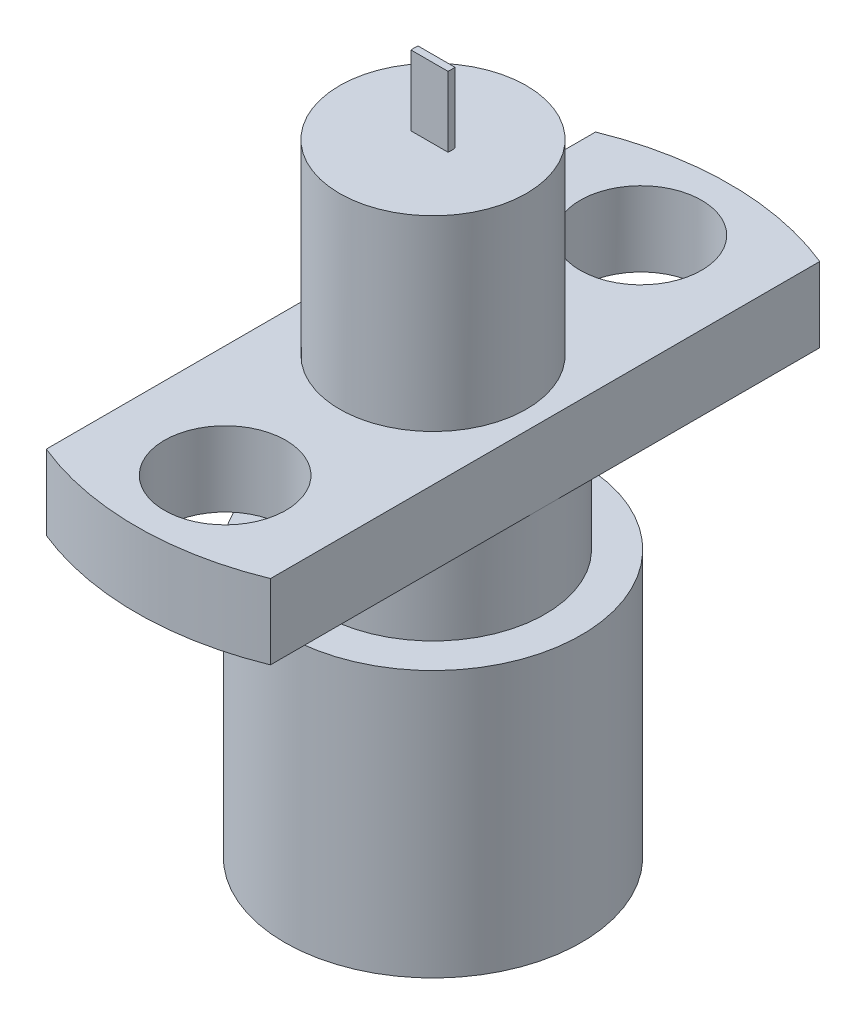
ISO-10303-21;
HEADER;
FILE_DESCRIPTION(('STEP AP214'),'2;1');
FILE_NAME('part.step','',(''),(''),'','','');
FILE_SCHEMA(('AUTOMOTIVE_DESIGN { 1 0 10303 214 1 1 1 1 }'));
ENDSEC;
DATA;
#1=APPLICATION_CONTEXT('core data for automotive mechanical design processes');
#2=APPLICATION_PROTOCOL_DEFINITION('international standard','automotive_design',2000,#1);
#3=PRODUCT_CONTEXT('',#1,'mechanical');
#4=PRODUCT('Part','Part','',(#3));
#5=PRODUCT_RELATED_PRODUCT_CATEGORY('part','',(#4));
#6=PRODUCT_DEFINITION_FORMATION('','',#4);
#7=PRODUCT_DEFINITION_CONTEXT('part definition',#1,'design');
#8=PRODUCT_DEFINITION('design','',#6,#7);
#9=PRODUCT_DEFINITION_SHAPE('','',#8);
#10=(LENGTH_UNIT() NAMED_UNIT(*) SI_UNIT(.MILLI.,.METRE.));
#11=(NAMED_UNIT(*) PLANE_ANGLE_UNIT() SI_UNIT($,.RADIAN.));
#12=(NAMED_UNIT(*) SI_UNIT($,.STERADIAN.) SOLID_ANGLE_UNIT());
#13=UNCERTAINTY_MEASURE_WITH_UNIT(LENGTH_MEASURE(1.E-05),#10,'distance_accuracy_value','');
#14=(GEOMETRIC_REPRESENTATION_CONTEXT(3) GLOBAL_UNCERTAINTY_ASSIGNED_CONTEXT((#13)) GLOBAL_UNIT_ASSIGNED_CONTEXT((#10,
#11,#12)) REPRESENTATION_CONTEXT('',''));
#15=CARTESIAN_POINT('',(0.,0.,0.));
#16=DIRECTION('',(0.,0.,1.));
#17=DIRECTION('',(1.,0.,0.));
#18=AXIS2_PLACEMENT_3D('',#15,#16,#17);
#19=CARTESIAN_POINT('',(0.,0.,0.));
#20=DIRECTION('',(0.,-1.,0.));
#21=DIRECTION('',(0.,0.,-1.));
#22=AXIS2_PLACEMENT_3D('',#19,#20,#21);
#23=PLANE('',#22);
#24=CARTESIAN_POINT('',(0.,0.,0.));
#25=DIRECTION('',(0.,-1.,0.));
#26=DIRECTION('',(0.,0.,-1.));
#27=AXIS2_PLACEMENT_3D('',#24,#25,#26);
#28=CIRCLE('',#27,2.4);
#29=CARTESIAN_POINT('',(2.4,0.,0.));
#30=VERTEX_POINT('',#29);
#31=CARTESIAN_POINT('',(-2.4,0.,0.));
#32=VERTEX_POINT('',#31);
#33=EDGE_CURVE('E48',#30,#32,#28,.T.);
#34=ORIENTED_EDGE('',*,*,#33,.F.);
#35=DIRECTION('',(0.,0.,-1.));
#36=VECTOR('',#35,1.);
#37=CARTESIAN_POINT('',(2.4,0.,-5.87898800815242));
#38=LINE('',#37,#36);
#39=CARTESIAN_POINT('',(2.4,0.,5.87898800815242));
#40=VERTEX_POINT('',#39);
#41=EDGE_CURVE('E111',#40,#30,#38,.T.);
#42=ORIENTED_EDGE('',*,*,#41,.F.);
#43=CARTESIAN_POINT('',(0.,0.,0.));
#44=DIRECTION('',(0.,1.,0.));
#45=DIRECTION('',(0.,0.,1.));
#46=AXIS2_PLACEMENT_3D('',#43,#44,#45);
#47=CIRCLE('',#46,6.35);
#48=CARTESIAN_POINT('',(-2.4,0.,5.87898800815242));
#49=VERTEX_POINT('',#48);
#50=EDGE_CURVE('E129',#49,#40,#47,.T.);
#51=ORIENTED_EDGE('',*,*,#50,.F.);
#52=DIRECTION('',(0.,0.,1.));
#53=VECTOR('',#52,1.);
#54=CARTESIAN_POINT('',(-2.4,0.,-5.87898800815242));
#55=LINE('',#54,#53);
#56=EDGE_CURVE('E132',#32,#49,#55,.T.);
#57=ORIENTED_EDGE('',*,*,#56,.F.);
#58=EDGE_LOOP('',(#34,#42,#51,#57));
#59=FACE_BOUND('',#58,.T.);
#60=CARTESIAN_POINT('',(0.,0.,4.45));
#61=DIRECTION('',(0.,-1.,0.));
#62=DIRECTION('',(0.,0.,-1.));
#63=AXIS2_PLACEMENT_3D('',#60,#61,#62);
#64=CIRCLE('',#63,1.3);
#65=CARTESIAN_POINT('',(0.,0.,3.15));
#66=VERTEX_POINT('',#65);
#67=EDGE_CURVE('E242',#66,#66,#64,.F.);
#68=ORIENTED_EDGE('',*,*,#67,.T.);
#69=EDGE_LOOP('',(#68));
#70=FACE_BOUND('',#69,.T.);
#71=ADVANCED_FACE('F38',(#59,#70),#23,.T.);
#72=CARTESIAN_POINT('',(0.,5.6,0.));
#73=DIRECTION('',(0.,1.,0.));
#74=DIRECTION('',(0.,0.,1.));
#75=AXIS2_PLACEMENT_3D('',#72,#73,#74);
#76=PLANE('',#75);
#77=CARTESIAN_POINT('',(0.,5.6,0.));
#78=DIRECTION('',(0.,1.,0.));
#79=DIRECTION('',(0.,0.,1.));
#80=AXIS2_PLACEMENT_3D('',#77,#78,#79);
#81=CIRCLE('',#80,2.);
#82=CARTESIAN_POINT('',(0.,5.6,2.));
#83=VERTEX_POINT('',#82);
#84=EDGE_CURVE('E239',#83,#83,#81,.T.);
#85=ORIENTED_EDGE('',*,*,#84,.T.);
#86=EDGE_LOOP('',(#85));
#87=FACE_BOUND('',#86,.T.);
#88=DIRECTION('',(-1.,0.,0.));
#89=VECTOR('',#88,1.);
#90=CARTESIAN_POINT('',(0.392905841137543,5.6,-0.075));
#91=LINE('',#90,#89);
#92=CARTESIAN_POINT('',(0.392905841137543,5.6,-0.075));
#93=VERTEX_POINT('',#92);
#94=CARTESIAN_POINT('',(-0.392905841137543,5.6,-0.075));
#95=VERTEX_POINT('',#94);
#96=EDGE_CURVE('E224',#93,#95,#91,.T.);
#97=ORIENTED_EDGE('',*,*,#96,.F.);
#98=CARTESIAN_POINT('',(0.,5.6,0.));
#99=DIRECTION('',(0.,1.,0.));
#100=DIRECTION('',(0.,0.,-1.));
#101=AXIS2_PLACEMENT_3D('',#98,#99,#100);
#102=CIRCLE('',#101,0.4);
#103=CARTESIAN_POINT('',(0.392905841137543,5.6,0.075));
#104=VERTEX_POINT('',#103);
#105=EDGE_CURVE('E219',#104,#93,#102,.T.);
#106=ORIENTED_EDGE('',*,*,#105,.F.);
#107=DIRECTION('',(1.,0.,0.));
#108=VECTOR('',#107,1.);
#109=CARTESIAN_POINT('',(0.392905841137543,5.6,0.075));
#110=LINE('',#109,#108);
#111=CARTESIAN_POINT('',(-0.392905841137543,5.6,0.075));
#112=VERTEX_POINT('',#111);
#113=EDGE_CURVE('E207',#112,#104,#110,.T.);
#114=ORIENTED_EDGE('',*,*,#113,.F.);
#115=CARTESIAN_POINT('',(0.,5.6,0.));
#116=DIRECTION('',(0.,1.,0.));
#117=DIRECTION('',(0.,0.,1.));
#118=AXIS2_PLACEMENT_3D('',#115,#116,#117);
#119=CIRCLE('',#118,0.4);
#120=EDGE_CURVE('E215',#95,#112,#119,.T.);
#121=ORIENTED_EDGE('',*,*,#120,.F.);
#122=EDGE_LOOP('',(#97,#106,#114,#121));
#123=FACE_BOUND('',#122,.T.);
#124=ADVANCED_FACE('F156',(#87,#123),#76,.T.);
#125=CARTESIAN_POINT('',(0.,1.6,0.));
#126=DIRECTION('',(0.,-1.,0.));
#127=DIRECTION('',(0.,0.,-1.));
#128=AXIS2_PLACEMENT_3D('',#125,#126,#127);
#129=CYLINDRICAL_SURFACE('',#128,6.35);
#130=CARTESIAN_POINT('',(0.,0.,0.));
#131=DIRECTION('',(0.,1.,0.));
#132=DIRECTION('',(0.,0.,-1.));
#133=AXIS2_PLACEMENT_3D('',#130,#131,#132);
#134=CIRCLE('',#133,6.35);
#135=CARTESIAN_POINT('',(2.4,0.,-5.87898800815242));
#136=VERTEX_POINT('',#135);
#137=CARTESIAN_POINT('',(-2.4,0.,-5.87898800815242));
#138=VERTEX_POINT('',#137);
#139=EDGE_CURVE('E128',#136,#138,#134,.T.);
#140=ORIENTED_EDGE('',*,*,#139,.T.);
#141=DIRECTION('',(0.,-1.,0.));
#142=VECTOR('',#141,1.);
#143=CARTESIAN_POINT('',(-2.4,1.6,-5.87898800815242));
#144=LINE('',#143,#142);
#145=CARTESIAN_POINT('',(-2.4,1.6,-5.87898800815242));
#146=VERTEX_POINT('',#145);
#147=EDGE_CURVE('E271',#146,#138,#144,.T.);
#148=ORIENTED_EDGE('',*,*,#147,.F.);
#149=CARTESIAN_POINT('',(0.,1.6,0.));
#150=DIRECTION('',(0.,1.,0.));
#151=DIRECTION('',(0.,0.,-1.));
#152=AXIS2_PLACEMENT_3D('',#149,#150,#151);
#153=CIRCLE('',#152,6.35);
#154=CARTESIAN_POINT('',(2.4,1.6,-5.87898800815242));
#155=VERTEX_POINT('',#154);
#156=EDGE_CURVE('E122',#155,#146,#153,.T.);
#157=ORIENTED_EDGE('',*,*,#156,.F.);
#158=DIRECTION('',(0.,-1.,0.));
#159=VECTOR('',#158,1.);
#160=CARTESIAN_POINT('',(2.4,1.6,-5.87898800815242));
#161=LINE('',#160,#159);
#162=EDGE_CURVE('E262',#155,#136,#161,.T.);
#163=ORIENTED_EDGE('',*,*,#162,.T.);
#164=EDGE_LOOP('',(#140,#148,#157,#163));
#165=FACE_BOUND('',#164,.T.);
#166=ADVANCED_FACE('F40',(#165),#129,.T.);
#167=CARTESIAN_POINT('',(-2.4,1.6,-5.87898800815242));
#168=DIRECTION('',(1.,0.,0.));
#169=DIRECTION('',(0.,0.,-1.));
#170=AXIS2_PLACEMENT_3D('',#167,#168,#169);
#171=PLANE('',#170);
#172=EDGE_CURVE('E264',#138,#32,#55,.T.);
#173=ORIENTED_EDGE('',*,*,#172,.T.);
#174=ORIENTED_EDGE('',*,*,#56,.T.);
#175=DIRECTION('',(0.,-1.,0.));
#176=VECTOR('',#175,1.);
#177=CARTESIAN_POINT('',(-2.4,1.6,5.87898800815242));
#178=LINE('',#177,#176);
#179=CARTESIAN_POINT('',(-2.4,1.6,5.87898800815242));
#180=VERTEX_POINT('',#179);
#181=EDGE_CURVE('E269',#180,#49,#178,.T.);
#182=ORIENTED_EDGE('',*,*,#181,.F.);
#183=DIRECTION('',(0.,0.,1.));
#184=VECTOR('',#183,1.);
#185=CARTESIAN_POINT('',(-2.4,1.6,-5.87898800815242));
#186=LINE('',#185,#184);
#187=EDGE_CURVE('E256',#146,#180,#186,.T.);
#188=ORIENTED_EDGE('',*,*,#187,.F.);
#189=ORIENTED_EDGE('',*,*,#147,.T.);
#190=EDGE_LOOP('',(#173,#174,#182,#188,#189));
#191=FACE_BOUND('',#190,.T.);
#192=ADVANCED_FACE('F277',(#191),#171,.F.);
#193=CARTESIAN_POINT('',(0.,1.6,0.));
#194=DIRECTION('',(0.,-1.,0.));
#195=DIRECTION('',(0.,0.,-1.));
#196=AXIS2_PLACEMENT_3D('',#193,#194,#195);
#197=CYLINDRICAL_SURFACE('',#196,6.35);
#198=ORIENTED_EDGE('',*,*,#50,.T.);
#199=DIRECTION('',(0.,-1.,0.));
#200=VECTOR('',#199,1.);
#201=CARTESIAN_POINT('',(2.4,1.6,5.87898800815242));
#202=LINE('',#201,#200);
#203=CARTESIAN_POINT('',(2.4,1.6,5.87898800815242));
#204=VERTEX_POINT('',#203);
#205=EDGE_CURVE('E118',#204,#40,#202,.T.);
#206=ORIENTED_EDGE('',*,*,#205,.F.);
#207=CARTESIAN_POINT('',(0.,1.6,0.));
#208=DIRECTION('',(0.,1.,0.));
#209=DIRECTION('',(0.,0.,1.));
#210=AXIS2_PLACEMENT_3D('',#207,#208,#209);
#211=CIRCLE('',#210,6.35);
#212=EDGE_CURVE('E258',#180,#204,#211,.T.);
#213=ORIENTED_EDGE('',*,*,#212,.F.);
#214=ORIENTED_EDGE('',*,*,#181,.T.);
#215=EDGE_LOOP('',(#198,#206,#213,#214));
#216=FACE_BOUND('',#215,.T.);
#217=ADVANCED_FACE('F179',(#216),#197,.T.);
#218=CARTESIAN_POINT('',(2.4,1.6,-5.87898800815242));
#219=DIRECTION('',(-1.,0.,0.));
#220=DIRECTION('',(0.,0.,1.));
#221=AXIS2_PLACEMENT_3D('',#218,#219,#220);
#222=PLANE('',#221);
#223=ORIENTED_EDGE('',*,*,#41,.T.);
#224=EDGE_CURVE('E114',#30,#136,#38,.T.);
#225=ORIENTED_EDGE('',*,*,#224,.T.);
#226=ORIENTED_EDGE('',*,*,#162,.F.);
#227=DIRECTION('',(0.,0.,-1.));
#228=VECTOR('',#227,1.);
#229=CARTESIAN_POINT('',(2.4,1.6,-5.87898800815242));
#230=LINE('',#229,#228);
#231=EDGE_CURVE('E260',#204,#155,#230,.T.);
#232=ORIENTED_EDGE('',*,*,#231,.F.);
#233=ORIENTED_EDGE('',*,*,#205,.T.);
#234=EDGE_LOOP('',(#223,#225,#226,#232,#233));
#235=FACE_BOUND('',#234,.T.);
#236=ADVANCED_FACE('F112',(#235),#222,.F.);
#237=CARTESIAN_POINT('',(0.,1.6,0.));
#238=DIRECTION('',(0.,-1.,0.));
#239=DIRECTION('',(0.,0.,-1.));
#240=AXIS2_PLACEMENT_3D('',#237,#238,#239);
#241=PLANE('',#240);
#242=CARTESIAN_POINT('',(0.,1.6,0.));
#243=DIRECTION('',(0.,-1.,0.));
#244=DIRECTION('',(0.,0.,-1.));
#245=AXIS2_PLACEMENT_3D('',#242,#243,#244);
#246=CIRCLE('',#245,2.);
#247=CARTESIAN_POINT('',(0.,1.6,-2.));
#248=VERTEX_POINT('',#247);
#249=EDGE_CURVE('E42',#248,#248,#246,.F.);
#250=ORIENTED_EDGE('',*,*,#249,.F.);
#251=EDGE_LOOP('',(#250));
#252=FACE_BOUND('',#251,.T.);
#253=CARTESIAN_POINT('',(0.,1.6,-4.45));
#254=DIRECTION('',(0.,1.,0.));
#255=DIRECTION('',(0.,0.,1.));
#256=AXIS2_PLACEMENT_3D('',#253,#254,#255);
#257=CIRCLE('',#256,1.3);
#258=CARTESIAN_POINT('',(0.,1.6,-3.15));
#259=VERTEX_POINT('',#258);
#260=EDGE_CURVE('E243',#259,#259,#257,.T.);
#261=ORIENTED_EDGE('',*,*,#260,.F.);
#262=EDGE_LOOP('',(#261));
#263=FACE_BOUND('',#262,.T.);
#264=CARTESIAN_POINT('',(0.,1.6,4.45));
#265=DIRECTION('',(0.,1.,0.));
#266=DIRECTION('',(0.,0.,-1.));
#267=AXIS2_PLACEMENT_3D('',#264,#265,#266);
#268=CIRCLE('',#267,1.3);
#269=CARTESIAN_POINT('',(0.,1.6,3.15));
#270=VERTEX_POINT('',#269);
#271=EDGE_CURVE('E247',#270,#270,#268,.T.);
#272=ORIENTED_EDGE('',*,*,#271,.F.);
#273=EDGE_LOOP('',(#272));
#274=FACE_BOUND('',#273,.T.);
#275=ORIENTED_EDGE('',*,*,#156,.T.);
#276=ORIENTED_EDGE('',*,*,#187,.T.);
#277=ORIENTED_EDGE('',*,*,#212,.T.);
#278=ORIENTED_EDGE('',*,*,#231,.T.);
#279=EDGE_LOOP('',(#275,#276,#277,#278));
#280=FACE_BOUND('',#279,.T.);
#281=ADVANCED_FACE('F167',(#252,#263,#274,#280),#241,.F.);
#282=EDGE_CURVE('E12',#32,#30,#28,.T.);
#283=ORIENTED_EDGE('',*,*,#282,.F.);
#284=ORIENTED_EDGE('',*,*,#172,.F.);
#285=ORIENTED_EDGE('',*,*,#139,.F.);
#286=ORIENTED_EDGE('',*,*,#224,.F.);
#287=EDGE_LOOP('',(#283,#284,#285,#286));
#288=FACE_BOUND('',#287,.T.);
#289=CARTESIAN_POINT('',(0.,0.,-4.45));
#290=DIRECTION('',(0.,-1.,0.));
#291=DIRECTION('',(0.,0.,-1.));
#292=AXIS2_PLACEMENT_3D('',#289,#290,#291);
#293=CIRCLE('',#292,1.3);
#294=CARTESIAN_POINT('',(0.,0.,-5.75));
#295=VERTEX_POINT('',#294);
#296=EDGE_CURVE('E246',#295,#295,#293,.F.);
#297=ORIENTED_EDGE('',*,*,#296,.T.);
#298=EDGE_LOOP('',(#297));
#299=FACE_BOUND('',#298,.T.);
#300=ADVANCED_FACE('F125',(#288,#299),#23,.T.);
#301=CARTESIAN_POINT('',(0.,-3.67695526217005,4.45));
#302=DIRECTION('',(0.,1.,0.));
#303=DIRECTION('',(0.,0.,1.));
#304=AXIS2_PLACEMENT_3D('',#301,#302,#303);
#305=CYLINDRICAL_SURFACE('',#304,1.3);
#306=ORIENTED_EDGE('',*,*,#271,.T.);
#307=EDGE_LOOP('',(#306));
#308=FACE_BOUND('',#307,.T.);
#309=ORIENTED_EDGE('',*,*,#67,.F.);
#310=EDGE_LOOP('',(#309));
#311=FACE_BOUND('',#310,.T.);
#312=ADVANCED_FACE('F166',(#308,#311),#305,.F.);
#313=CARTESIAN_POINT('',(0.,-3.67695526217005,-4.45));
#314=DIRECTION('',(0.,1.,0.));
#315=DIRECTION('',(0.,0.,1.));
#316=AXIS2_PLACEMENT_3D('',#313,#314,#315);
#317=CYLINDRICAL_SURFACE('',#316,1.3);
#318=ORIENTED_EDGE('',*,*,#260,.T.);
#319=EDGE_LOOP('',(#318));
#320=FACE_BOUND('',#319,.T.);
#321=ORIENTED_EDGE('',*,*,#296,.F.);
#322=EDGE_LOOP('',(#321));
#323=FACE_BOUND('',#322,.T.);
#324=ADVANCED_FACE('F172',(#320,#323),#317,.F.);
#325=CARTESIAN_POINT('',(0.,5.6,0.));
#326=DIRECTION('',(0.,-1.,0.));
#327=DIRECTION('',(0.,0.,-1.));
#328=AXIS2_PLACEMENT_3D('',#325,#326,#327);
#329=CYLINDRICAL_SURFACE('',#328,2.);
#330=ORIENTED_EDGE('',*,*,#84,.F.);
#331=EDGE_LOOP('',(#330));
#332=FACE_BOUND('',#331,.T.);
#333=ORIENTED_EDGE('',*,*,#249,.T.);
#334=EDGE_LOOP('',(#333));
#335=FACE_BOUND('',#334,.T.);
#336=ADVANCED_FACE('F185',(#332,#335),#329,.T.);
#337=CARTESIAN_POINT('',(0.,7.1,0.));
#338=DIRECTION('',(0.,-1.,0.));
#339=DIRECTION('',(0.,0.,-1.));
#340=AXIS2_PLACEMENT_3D('',#337,#338,#339);
#341=CYLINDRICAL_SURFACE('',#340,0.4);
#342=ORIENTED_EDGE('',*,*,#105,.T.);
#343=DIRECTION('',(0.,-1.,0.));
#344=VECTOR('',#343,1.);
#345=CARTESIAN_POINT('',(0.392905841137543,7.1,-0.075));
#346=LINE('',#345,#344);
#347=CARTESIAN_POINT('',(0.392905841137543,7.1,-0.075));
#348=VERTEX_POINT('',#347);
#349=EDGE_CURVE('E237',#348,#93,#346,.T.);
#350=ORIENTED_EDGE('',*,*,#349,.F.);
#351=CARTESIAN_POINT('',(0.,7.1,0.));
#352=DIRECTION('',(0.,1.,0.));
#353=DIRECTION('',(0.,0.,-1.));
#354=AXIS2_PLACEMENT_3D('',#351,#352,#353);
#355=CIRCLE('',#354,0.4);
#356=CARTESIAN_POINT('',(0.392905841137543,7.1,0.075));
#357=VERTEX_POINT('',#356);
#358=EDGE_CURVE('E214',#357,#348,#355,.T.);
#359=ORIENTED_EDGE('',*,*,#358,.F.);
#360=DIRECTION('',(0.,-1.,0.));
#361=VECTOR('',#360,1.);
#362=CARTESIAN_POINT('',(0.392905841137543,7.1,0.075));
#363=LINE('',#362,#361);
#364=EDGE_CURVE('E209',#357,#104,#363,.T.);
#365=ORIENTED_EDGE('',*,*,#364,.T.);
#366=EDGE_LOOP('',(#342,#350,#359,#365));
#367=FACE_BOUND('',#366,.T.);
#368=ADVANCED_FACE('F188',(#367),#341,.T.);
#369=CARTESIAN_POINT('',(0.392905841137543,7.1,-0.075));
#370=DIRECTION('',(0.,0.,1.));
#371=DIRECTION('',(1.,0.,0.));
#372=AXIS2_PLACEMENT_3D('',#369,#370,#371);
#373=PLANE('',#372);
#374=ORIENTED_EDGE('',*,*,#96,.T.);
#375=DIRECTION('',(0.,-1.,0.));
#376=VECTOR('',#375,1.);
#377=CARTESIAN_POINT('',(-0.392905841137543,7.1,-0.075));
#378=LINE('',#377,#376);
#379=CARTESIAN_POINT('',(-0.392905841137543,7.1,-0.075));
#380=VERTEX_POINT('',#379);
#381=EDGE_CURVE('E234',#380,#95,#378,.T.);
#382=ORIENTED_EDGE('',*,*,#381,.F.);
#383=DIRECTION('',(-1.,0.,0.));
#384=VECTOR('',#383,1.);
#385=CARTESIAN_POINT('',(0.392905841137543,7.1,-0.075));
#386=LINE('',#385,#384);
#387=EDGE_CURVE('E408',#348,#380,#386,.T.);
#388=ORIENTED_EDGE('',*,*,#387,.F.);
#389=ORIENTED_EDGE('',*,*,#349,.T.);
#390=EDGE_LOOP('',(#374,#382,#388,#389));
#391=FACE_BOUND('',#390,.T.);
#392=ADVANCED_FACE('F193',(#391),#373,.F.);
#393=CARTESIAN_POINT('',(0.,7.1,0.));
#394=DIRECTION('',(0.,-1.,0.));
#395=DIRECTION('',(0.,0.,-1.));
#396=AXIS2_PLACEMENT_3D('',#393,#394,#395);
#397=CYLINDRICAL_SURFACE('',#396,0.4);
#398=ORIENTED_EDGE('',*,*,#120,.T.);
#399=DIRECTION('',(0.,-1.,0.));
#400=VECTOR('',#399,1.);
#401=CARTESIAN_POINT('',(-0.392905841137543,7.1,0.075));
#402=LINE('',#401,#400);
#403=CARTESIAN_POINT('',(-0.392905841137543,7.1,0.075));
#404=VERTEX_POINT('',#403);
#405=EDGE_CURVE('E61',#404,#112,#402,.T.);
#406=ORIENTED_EDGE('',*,*,#405,.F.);
#407=CARTESIAN_POINT('',(0.,7.1,0.));
#408=DIRECTION('',(0.,1.,0.));
#409=DIRECTION('',(0.,0.,1.));
#410=AXIS2_PLACEMENT_3D('',#407,#408,#409);
#411=CIRCLE('',#410,0.4);
#412=EDGE_CURVE('E409',#380,#404,#411,.T.);
#413=ORIENTED_EDGE('',*,*,#412,.F.);
#414=ORIENTED_EDGE('',*,*,#381,.T.);
#415=EDGE_LOOP('',(#398,#406,#413,#414));
#416=FACE_BOUND('',#415,.T.);
#417=ADVANCED_FACE('F197',(#416),#397,.T.);
#418=CARTESIAN_POINT('',(0.392905841137543,7.1,0.075));
#419=DIRECTION('',(0.,0.,-1.));
#420=DIRECTION('',(-1.,0.,0.));
#421=AXIS2_PLACEMENT_3D('',#418,#419,#420);
#422=PLANE('',#421);
#423=ORIENTED_EDGE('',*,*,#113,.T.);
#424=ORIENTED_EDGE('',*,*,#364,.F.);
#425=DIRECTION('',(1.,0.,0.));
#426=VECTOR('',#425,1.);
#427=CARTESIAN_POINT('',(0.392905841137543,7.1,0.075));
#428=LINE('',#427,#426);
#429=EDGE_CURVE('E222',#404,#357,#428,.T.);
#430=ORIENTED_EDGE('',*,*,#429,.F.);
#431=ORIENTED_EDGE('',*,*,#405,.T.);
#432=EDGE_LOOP('',(#423,#424,#430,#431));
#433=FACE_BOUND('',#432,.T.);
#434=ADVANCED_FACE('F150',(#433),#422,.F.);
#435=CARTESIAN_POINT('',(0.,7.1,0.));
#436=DIRECTION('',(0.,-1.,0.));
#437=DIRECTION('',(0.,0.,-1.));
#438=AXIS2_PLACEMENT_3D('',#435,#436,#437);
#439=PLANE('',#438);
#440=ORIENTED_EDGE('',*,*,#358,.T.);
#441=ORIENTED_EDGE('',*,*,#387,.T.);
#442=ORIENTED_EDGE('',*,*,#412,.T.);
#443=ORIENTED_EDGE('',*,*,#429,.T.);
#444=EDGE_LOOP('',(#440,#441,#442,#443));
#445=FACE_BOUND('',#444,.T.);
#446=ADVANCED_FACE('F140',(#445),#439,.F.);
#447=CARTESIAN_POINT('',(0.,-2.,0.));
#448=DIRECTION('',(0.,1.,0.));
#449=DIRECTION('',(0.,0.,1.));
#450=AXIS2_PLACEMENT_3D('',#447,#448,#449);
#451=CYLINDRICAL_SURFACE('',#450,2.4);
#452=CARTESIAN_POINT('',(0.,-2.,0.));
#453=DIRECTION('',(0.,-1.,0.));
#454=DIRECTION('',(0.,0.,-1.));
#455=AXIS2_PLACEMENT_3D('',#452,#453,#454);
#456=CIRCLE('',#455,2.4);
#457=CARTESIAN_POINT('',(0.,-2.,-2.4));
#458=VERTEX_POINT('',#457);
#459=EDGE_CURVE('E135',#458,#458,#456,.T.);
#460=ORIENTED_EDGE('',*,*,#459,.F.);
#461=EDGE_LOOP('',(#460));
#462=FACE_BOUND('',#461,.T.);
#463=ORIENTED_EDGE('',*,*,#33,.T.);
#464=ORIENTED_EDGE('',*,*,#282,.T.);
#465=EDGE_LOOP('',(#463,#464));
#466=FACE_BOUND('',#465,.T.);
#467=ADVANCED_FACE('F137',(#462,#466),#451,.T.);
#468=CARTESIAN_POINT('',(0.,-25.9802561210692,0.));
#469=DIRECTION('',(0.,1.,0.));
#470=DIRECTION('',(0.,0.,1.));
#471=AXIS2_PLACEMENT_3D('',#468,#469,#470);
#472=CYLINDRICAL_SURFACE('',#471,3.175);
#473=CARTESIAN_POINT('',(0.,-2.,0.));
#474=DIRECTION('',(0.,-1.,0.));
#475=DIRECTION('',(0.,0.,-1.));
#476=AXIS2_PLACEMENT_3D('',#473,#474,#475);
#477=CIRCLE('',#476,3.175);
#478=CARTESIAN_POINT('',(0.,-2.,3.175));
#479=VERTEX_POINT('',#478);
#480=EDGE_CURVE('E402',#479,#479,#477,.T.);
#481=CARTESIAN_POINT('',(0.,-7.7,0.));
#482=DIRECTION('',(0.,-1.,0.));
#483=DIRECTION('',(0.,0.,-1.));
#484=AXIS2_PLACEMENT_3D('',#481,#482,#483);
#485=CIRCLE('',#484,3.175);
#486=CARTESIAN_POINT('',(0.,-7.7,3.175));
#487=VERTEX_POINT('',#486);
#488=EDGE_CURVE('E136',#487,#487,#485,.T.);
#489=CARTESIAN_POINT('',(0.,-2.,3.175));
#490=CARTESIAN_POINT('',(0.,-2.059375,3.175));
#491=CARTESIAN_POINT('',(0.,-2.11875,3.175));
#492=CARTESIAN_POINT('',(0.,-2.2375,3.175));
#493=CARTESIAN_POINT('',(0.,-2.296875,3.175));
#494=CARTESIAN_POINT('',(0.,-2.415625,3.175));
#495=CARTESIAN_POINT('',(0.,-2.475,3.175));
#496=CARTESIAN_POINT('',(0.,-2.59375,3.175));
#497=CARTESIAN_POINT('',(0.,-2.653125,3.175));
#498=CARTESIAN_POINT('',(0.,-2.771875,3.175));
#499=CARTESIAN_POINT('',(0.,-2.83125,3.175));
#500=CARTESIAN_POINT('',(0.,-2.95,3.175));
#501=CARTESIAN_POINT('',(0.,-3.009375,3.175));
#502=CARTESIAN_POINT('',(0.,-3.128125,3.175));
#503=CARTESIAN_POINT('',(0.,-3.1875,3.175));
#504=CARTESIAN_POINT('',(0.,-3.30625,3.175));
#505=CARTESIAN_POINT('',(0.,-3.365625,3.175));
#506=CARTESIAN_POINT('',(0.,-3.484375,3.175));
#507=CARTESIAN_POINT('',(0.,-3.54375,3.175));
#508=CARTESIAN_POINT('',(0.,-3.6625,3.175));
#509=CARTESIAN_POINT('',(0.,-3.721875,3.175));
#510=CARTESIAN_POINT('',(0.,-3.840625,3.175));
#511=CARTESIAN_POINT('',(0.,-3.9,3.175));
#512=CARTESIAN_POINT('',(0.,-4.01875,3.175));
#513=CARTESIAN_POINT('',(0.,-4.078125,3.175));
#514=CARTESIAN_POINT('',(0.,-4.196875,3.175));
#515=CARTESIAN_POINT('',(0.,-4.25625,3.175));
#516=CARTESIAN_POINT('',(0.,-4.375,3.175));
#517=CARTESIAN_POINT('',(0.,-4.434375,3.175));
#518=CARTESIAN_POINT('',(0.,-4.553125,3.175));
#519=CARTESIAN_POINT('',(0.,-4.6125,3.175));
#520=CARTESIAN_POINT('',(0.,-4.73125,3.175));
#521=CARTESIAN_POINT('',(0.,-4.790625,3.175));
#522=CARTESIAN_POINT('',(0.,-4.909375,3.175));
#523=CARTESIAN_POINT('',(0.,-4.96875,3.175));
#524=CARTESIAN_POINT('',(0.,-5.0875,3.175));
#525=CARTESIAN_POINT('',(0.,-5.146875,3.175));
#526=CARTESIAN_POINT('',(0.,-5.265625,3.175));
#527=CARTESIAN_POINT('',(0.,-5.325,3.175));
#528=CARTESIAN_POINT('',(0.,-5.44375,3.175));
#529=CARTESIAN_POINT('',(0.,-5.503125,3.175));
#530=CARTESIAN_POINT('',(0.,-5.621875,3.175));
#531=CARTESIAN_POINT('',(0.,-5.68125,3.175));
#532=CARTESIAN_POINT('',(0.,-5.8,3.175));
#533=CARTESIAN_POINT('',(0.,-5.859375,3.175));
#534=CARTESIAN_POINT('',(0.,-5.978125,3.175));
#535=CARTESIAN_POINT('',(0.,-6.0375,3.175));
#536=CARTESIAN_POINT('',(0.,-6.15625,3.175));
#537=CARTESIAN_POINT('',(0.,-6.215625,3.175));
#538=CARTESIAN_POINT('',(0.,-6.334375,3.175));
#539=CARTESIAN_POINT('',(0.,-6.39375,3.175));
#540=CARTESIAN_POINT('',(0.,-6.5125,3.175));
#541=CARTESIAN_POINT('',(0.,-6.571875,3.175));
#542=CARTESIAN_POINT('',(0.,-6.690625,3.175));
#543=CARTESIAN_POINT('',(0.,-6.75,3.175));
#544=CARTESIAN_POINT('',(0.,-6.86875,3.175));
#545=CARTESIAN_POINT('',(0.,-6.928125,3.175));
#546=CARTESIAN_POINT('',(0.,-7.046875,3.175));
#547=CARTESIAN_POINT('',(0.,-7.10625,3.175));
#548=CARTESIAN_POINT('',(0.,-7.225,3.175));
#549=CARTESIAN_POINT('',(0.,-7.284375,3.175));
#550=CARTESIAN_POINT('',(0.,-7.403125,3.175));
#551=CARTESIAN_POINT('',(0.,-7.4625,3.175));
#552=CARTESIAN_POINT('',(0.,-7.58125,3.175));
#553=CARTESIAN_POINT('',(0.,-7.640625,3.175));
#554=CARTESIAN_POINT('',(0.,-7.7,3.175));
#555=B_SPLINE_CURVE_WITH_KNOTS('',3,(#489,#490,#491,#492,#493,#494,#495,#496,#497,#498,#499,
#500,#501,#502,#503,#504,#505,#506,#507,#508,#509,#510,#511,#512,#513,#514,#515,#516,#517,#518,
#519,#520,#521,#522,#523,#524,#525,#526,#527,#528,#529,#530,#531,#532,#533,#534,#535,#536,#537,
#538,#539,#540,#541,#542,#543,#544,#545,#546,#547,#548,#549,#550,#551,#552,#553,#554),
.UNSPECIFIED.,.F.,.F.,(4,2,2,2,2,2,2,2,2,2,2,2,2,2,2,2,2,2,2,2,2,2,2,2,2,2,2,2,2,2,2,2,4),(0.,
0.178125000000001,0.356249999999999,0.534375,0.712500000000001,0.890624999999999,1.06875,
1.246875,1.425,1.603125,1.78125,1.959375,2.1375,2.315625,2.49375,2.671875,2.85,3.028125,3.20625,
3.384375,3.5625,3.740625,3.91875,4.096875,4.275,4.453125,4.63125,4.809375,4.9875,5.165625,
5.34375,5.521875,5.7),.UNSPECIFIED.);
#556=EDGE_CURVE('BSEAM139',#479,#487,#555,.T.);
#557=ORIENTED_EDGE('',*,*,#480,.T.);
#558=ORIENTED_EDGE('',*,*,#488,.F.);
#559=ORIENTED_EDGE('',*,*,#556,.T.);
#560=ORIENTED_EDGE('',*,*,#556,.F.);
#561=EDGE_LOOP('',(#557,#559,#558,#560));
#562=FACE_BOUND('',#561,.T.);
#563=ADVANCED_FACE('F139',(#562),#472,.T.);
#564=CARTESIAN_POINT('',(0.,-2.,0.));
#565=DIRECTION('',(0.,-1.,0.));
#566=DIRECTION('',(0.,0.,-1.));
#567=AXIS2_PLACEMENT_3D('',#564,#565,#566);
#568=PLANE('',#567);
#569=ORIENTED_EDGE('',*,*,#459,.T.);
#570=EDGE_LOOP('',(#569));
#571=FACE_BOUND('',#570,.T.);
#572=ORIENTED_EDGE('',*,*,#480,.F.);
#573=EDGE_LOOP('',(#572));
#574=FACE_BOUND('',#573,.T.);
#575=ADVANCED_FACE('F147',(#571,#574),#568,.F.);
#576=CARTESIAN_POINT('',(0.,-7.7,0.));
#577=DIRECTION('',(0.,-1.,0.));
#578=DIRECTION('',(0.,0.,-1.));
#579=AXIS2_PLACEMENT_3D('',#576,#577,#578);
#580=PLANE('',#579);
#581=ORIENTED_EDGE('',*,*,#488,.T.);
#582=EDGE_LOOP('',(#581));
#583=FACE_BOUND('',#582,.T.);
#584=ADVANCED_FACE('F380',(#583),#580,.T.);
#585=CLOSED_SHELL('',(#71,#124,#166,#192,#217,#236,#281,#300,#312,#324,#336,#368,#392,#417,#434,
#446,#467,#563,#575,#584));
#586=MANIFOLD_SOLID_BREP('B2',#585);
#587=ADVANCED_BREP_SHAPE_REPRESENTATION('',(#18,#586),#14);
#588=SHAPE_DEFINITION_REPRESENTATION(#9,#587);
ENDSEC;
END-ISO-10303-21;
